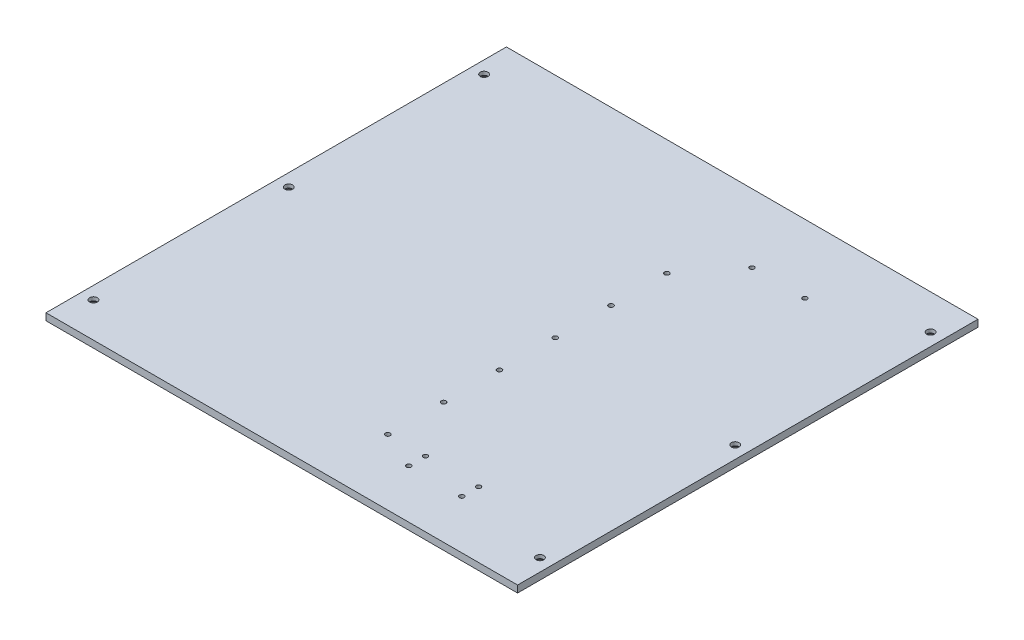
ISO-10303-21;
HEADER;
FILE_DESCRIPTION(('STEP AP214'),'2;1');
FILE_NAME('part.step','',(''),(''),'','','');
FILE_SCHEMA(('AUTOMOTIVE_DESIGN { 1 0 10303 214 1 1 1 1 }'));
ENDSEC;
DATA;
#1=APPLICATION_CONTEXT('core data for automotive mechanical design processes');
#2=APPLICATION_PROTOCOL_DEFINITION('international standard','automotive_design',2000,#1);
#3=PRODUCT_CONTEXT('',#1,'mechanical');
#4=PRODUCT('Part','Part','',(#3));
#5=PRODUCT_RELATED_PRODUCT_CATEGORY('part','',(#4));
#6=PRODUCT_DEFINITION_FORMATION('','',#4);
#7=PRODUCT_DEFINITION_CONTEXT('part definition',#1,'design');
#8=PRODUCT_DEFINITION('design','',#6,#7);
#9=PRODUCT_DEFINITION_SHAPE('','',#8);
#10=(LENGTH_UNIT() NAMED_UNIT(*) SI_UNIT(.MILLI.,.METRE.));
#11=(NAMED_UNIT(*) PLANE_ANGLE_UNIT() SI_UNIT($,.RADIAN.));
#12=(NAMED_UNIT(*) SI_UNIT($,.STERADIAN.) SOLID_ANGLE_UNIT());
#13=UNCERTAINTY_MEASURE_WITH_UNIT(LENGTH_MEASURE(1.E-05),#10,'distance_accuracy_value','');
#14=(GEOMETRIC_REPRESENTATION_CONTEXT(3) GLOBAL_UNCERTAINTY_ASSIGNED_CONTEXT((#13)) GLOBAL_UNIT_ASSIGNED_CONTEXT((#10,
#11,#12)) REPRESENTATION_CONTEXT('',''));
#15=CARTESIAN_POINT('',(0.,0.,0.));
#16=DIRECTION('',(0.,0.,1.));
#17=DIRECTION('',(1.,0.,0.));
#18=AXIS2_PLACEMENT_3D('',#15,#16,#17);
#19=CARTESIAN_POINT('',(0.,5.,0.));
#20=DIRECTION('',(0.,0.,-1.));
#21=DIRECTION('',(-1.,0.,0.));
#22=AXIS2_PLACEMENT_3D('',#19,#20,#21);
#23=PLANE('',#22);
#24=DIRECTION('',(1.,0.,0.));
#25=VECTOR('',#24,1.);
#26=CARTESIAN_POINT('',(0.,5.,0.));
#27=LINE('',#26,#25);
#28=CARTESIAN_POINT('',(1.00000000000004,5.,0.));
#29=VERTEX_POINT('',#28);
#30=CARTESIAN_POINT('',(339.,5.,0.));
#31=VERTEX_POINT('',#30);
#32=EDGE_CURVE('E96',#29,#31,#27,.T.);
#33=ORIENTED_EDGE('',*,*,#32,.F.);
#34=DIRECTION('',(0.,1.,0.));
#35=VECTOR('',#34,1.);
#36=CARTESIAN_POINT('',(1.00000000000004,-5.,0.));
#37=LINE('',#36,#35);
#38=CARTESIAN_POINT('',(1.00000000000004,0.,0.));
#39=VERTEX_POINT('',#38);
#40=EDGE_CURVE('E77',#39,#29,#37,.T.);
#41=ORIENTED_EDGE('',*,*,#40,.F.);
#42=DIRECTION('',(1.,0.,0.));
#43=VECTOR('',#42,1.);
#44=CARTESIAN_POINT('',(0.,0.,0.));
#45=LINE('',#44,#43);
#46=CARTESIAN_POINT('',(339.,0.,0.));
#47=VERTEX_POINT('',#46);
#48=EDGE_CURVE('E57',#39,#47,#45,.T.);
#49=ORIENTED_EDGE('',*,*,#48,.T.);
#50=DIRECTION('',(0.,1.,0.));
#51=VECTOR('',#50,1.);
#52=CARTESIAN_POINT('',(339.,-5.,0.));
#53=LINE('',#52,#51);
#54=EDGE_CURVE('E141',#47,#31,#53,.T.);
#55=ORIENTED_EDGE('',*,*,#54,.T.);
#56=EDGE_LOOP('',(#33,#41,#49,#55));
#57=FACE_BOUND('',#56,.T.);
#58=ADVANCED_FACE('F36',(#57),#23,.F.);
#59=CARTESIAN_POINT('',(0.,5.,-330.));
#60=DIRECTION('',(0.,0.,1.));
#61=DIRECTION('',(1.,0.,0.));
#62=AXIS2_PLACEMENT_3D('',#59,#60,#61);
#63=PLANE('',#62);
#64=DIRECTION('',(-1.,0.,0.));
#65=VECTOR('',#64,1.);
#66=CARTESIAN_POINT('',(0.,0.,-330.));
#67=LINE('',#66,#65);
#68=CARTESIAN_POINT('',(339.,0.,-330.));
#69=VERTEX_POINT('',#68);
#70=CARTESIAN_POINT('',(1.,0.,-330.));
#71=VERTEX_POINT('',#70);
#72=EDGE_CURVE('E90',#69,#71,#67,.T.);
#73=ORIENTED_EDGE('',*,*,#72,.T.);
#74=DIRECTION('',(0.,1.,0.));
#75=VECTOR('',#74,1.);
#76=CARTESIAN_POINT('',(1.,-5.,-330.));
#77=LINE('',#76,#75);
#78=CARTESIAN_POINT('',(1.,5.,-330.));
#79=VERTEX_POINT('',#78);
#80=EDGE_CURVE('E49',#71,#79,#77,.T.);
#81=ORIENTED_EDGE('',*,*,#80,.T.);
#82=DIRECTION('',(-1.,0.,0.));
#83=VECTOR('',#82,1.);
#84=CARTESIAN_POINT('',(0.,5.,-330.));
#85=LINE('',#84,#83);
#86=CARTESIAN_POINT('',(339.,5.,-330.));
#87=VERTEX_POINT('',#86);
#88=EDGE_CURVE('E88',#87,#79,#85,.T.);
#89=ORIENTED_EDGE('',*,*,#88,.F.);
#90=DIRECTION('',(0.,1.,0.));
#91=VECTOR('',#90,1.);
#92=CARTESIAN_POINT('',(339.,-5.,-330.));
#93=LINE('',#92,#91);
#94=EDGE_CURVE('E140',#69,#87,#93,.T.);
#95=ORIENTED_EDGE('',*,*,#94,.F.);
#96=EDGE_LOOP('',(#73,#81,#89,#95));
#97=FACE_BOUND('',#96,.T.);
#98=ADVANCED_FACE('F86',(#97),#63,.F.);
#99=CARTESIAN_POINT('',(0.,5.,0.));
#100=DIRECTION('',(0.,-1.,0.));
#101=DIRECTION('',(0.,0.,-1.));
#102=AXIS2_PLACEMENT_3D('',#99,#100,#101);
#103=PLANE('',#102);
#104=CARTESIAN_POINT('',(10.,5.,-25.));
#105=DIRECTION('',(0.,-1.,0.));
#106=DIRECTION('',(0.,0.,-1.));
#107=AXIS2_PLACEMENT_3D('',#104,#105,#106);
#108=CIRCLE('',#107,2.75);
#109=CARTESIAN_POINT('',(10.,5.,-27.75));
#110=VERTEX_POINT('',#109);
#111=EDGE_CURVE('E226',#110,#110,#108,.T.);
#112=ORIENTED_EDGE('',*,*,#111,.T.);
#113=EDGE_LOOP('',(#112));
#114=FACE_BOUND('',#113,.T.);
#115=CARTESIAN_POINT('',(10.,5.,-165.));
#116=DIRECTION('',(0.,-1.,0.));
#117=DIRECTION('',(0.,0.,-1.));
#118=AXIS2_PLACEMENT_3D('',#115,#116,#117);
#119=CIRCLE('',#118,2.75);
#120=CARTESIAN_POINT('',(10.,5.,-167.75));
#121=VERTEX_POINT('',#120);
#122=EDGE_CURVE('E217',#121,#121,#119,.T.);
#123=ORIENTED_EDGE('',*,*,#122,.T.);
#124=EDGE_LOOP('',(#123));
#125=FACE_BOUND('',#124,.T.);
#126=CARTESIAN_POINT('',(10.,5.,-305.));
#127=DIRECTION('',(0.,-1.,0.));
#128=DIRECTION('',(0.,0.,-1.));
#129=AXIS2_PLACEMENT_3D('',#126,#127,#128);
#130=CIRCLE('',#129,2.75);
#131=CARTESIAN_POINT('',(10.,5.,-307.75));
#132=VERTEX_POINT('',#131);
#133=EDGE_CURVE('E208',#132,#132,#130,.T.);
#134=ORIENTED_EDGE('',*,*,#133,.T.);
#135=EDGE_LOOP('',(#134));
#136=FACE_BOUND('',#135,.T.);
#137=CARTESIAN_POINT('',(330.,5.,-305.));
#138=DIRECTION('',(0.,-1.,0.));
#139=DIRECTION('',(0.,0.,-1.));
#140=AXIS2_PLACEMENT_3D('',#137,#138,#139);
#141=CIRCLE('',#140,2.74999999999997);
#142=CARTESIAN_POINT('',(330.,5.,-307.75));
#143=VERTEX_POINT('',#142);
#144=EDGE_CURVE('E199',#143,#143,#141,.T.);
#145=ORIENTED_EDGE('',*,*,#144,.T.);
#146=EDGE_LOOP('',(#145));
#147=FACE_BOUND('',#146,.T.);
#148=CARTESIAN_POINT('',(330.,5.,-165.));
#149=DIRECTION('',(0.,-1.,0.));
#150=DIRECTION('',(0.,0.,-1.));
#151=AXIS2_PLACEMENT_3D('',#148,#149,#150);
#152=CIRCLE('',#151,2.74999999999997);
#153=CARTESIAN_POINT('',(330.,5.,-167.75));
#154=VERTEX_POINT('',#153);
#155=EDGE_CURVE('E190',#154,#154,#152,.T.);
#156=ORIENTED_EDGE('',*,*,#155,.T.);
#157=EDGE_LOOP('',(#156));
#158=FACE_BOUND('',#157,.T.);
#159=CARTESIAN_POINT('',(330.,5.,-25.));
#160=DIRECTION('',(0.,-1.,0.));
#161=DIRECTION('',(0.,0.,-1.));
#162=AXIS2_PLACEMENT_3D('',#159,#160,#161);
#163=CIRCLE('',#162,2.74999999999997);
#164=CARTESIAN_POINT('',(330.,5.,-27.75));
#165=VERTEX_POINT('',#164);
#166=EDGE_CURVE('E181',#165,#165,#163,.T.);
#167=ORIENTED_EDGE('',*,*,#166,.T.);
#168=EDGE_LOOP('',(#167));
#169=FACE_BOUND('',#168,.T.);
#170=CARTESIAN_POINT('',(199.,5.,-47.));
#171=DIRECTION('',(0.,-1.,0.));
#172=DIRECTION('',(0.,0.,-1.));
#173=AXIS2_PLACEMENT_3D('',#170,#171,#172);
#174=CIRCLE('',#173,1.70000000000001);
#175=CARTESIAN_POINT('',(199.,5.,-48.7));
#176=VERTEX_POINT('',#175);
#177=EDGE_CURVE('E175',#176,#176,#174,.T.);
#178=ORIENTED_EDGE('',*,*,#177,.T.);
#179=EDGE_LOOP('',(#178));
#180=FACE_BOUND('',#179,.T.);
#181=CARTESIAN_POINT('',(199.,5.,-87.));
#182=DIRECTION('',(0.,-1.,0.));
#183=DIRECTION('',(0.,0.,-1.));
#184=AXIS2_PLACEMENT_3D('',#181,#182,#183);
#185=CIRCLE('',#184,1.70000000000001);
#186=CARTESIAN_POINT('',(199.,5.,-88.7));
#187=VERTEX_POINT('',#186);
#188=EDGE_CURVE('E169',#187,#187,#185,.T.);
#189=ORIENTED_EDGE('',*,*,#188,.T.);
#190=EDGE_LOOP('',(#189));
#191=FACE_BOUND('',#190,.T.);
#192=CARTESIAN_POINT('',(199.,5.,-127.));
#193=DIRECTION('',(0.,-1.,0.));
#194=DIRECTION('',(0.,0.,-1.));
#195=AXIS2_PLACEMENT_3D('',#192,#193,#194);
#196=CIRCLE('',#195,1.70000000000001);
#197=CARTESIAN_POINT('',(199.,5.,-128.7));
#198=VERTEX_POINT('',#197);
#199=EDGE_CURVE('E163',#198,#198,#196,.T.);
#200=ORIENTED_EDGE('',*,*,#199,.T.);
#201=EDGE_LOOP('',(#200));
#202=FACE_BOUND('',#201,.T.);
#203=CARTESIAN_POINT('',(199.,5.,-167.));
#204=DIRECTION('',(0.,-1.,0.));
#205=DIRECTION('',(0.,0.,-1.));
#206=AXIS2_PLACEMENT_3D('',#203,#204,#205);
#207=CIRCLE('',#206,1.70000000000001);
#208=CARTESIAN_POINT('',(199.,5.,-168.7));
#209=VERTEX_POINT('',#208);
#210=EDGE_CURVE('E157',#209,#209,#207,.T.);
#211=ORIENTED_EDGE('',*,*,#210,.T.);
#212=EDGE_LOOP('',(#211));
#213=FACE_BOUND('',#212,.T.);
#214=CARTESIAN_POINT('',(199.,5.,-207.));
#215=DIRECTION('',(0.,-1.,0.));
#216=DIRECTION('',(0.,0.,-1.));
#217=AXIS2_PLACEMENT_3D('',#214,#215,#216);
#218=CIRCLE('',#217,1.70000000000001);
#219=CARTESIAN_POINT('',(199.,5.,-208.7));
#220=VERTEX_POINT('',#219);
#221=EDGE_CURVE('E151',#220,#220,#218,.T.);
#222=ORIENTED_EDGE('',*,*,#221,.T.);
#223=EDGE_LOOP('',(#222));
#224=FACE_BOUND('',#223,.T.);
#225=CARTESIAN_POINT('',(199.,5.,-247.));
#226=DIRECTION('',(0.,-1.,0.));
#227=DIRECTION('',(0.,0.,-1.));
#228=AXIS2_PLACEMENT_3D('',#225,#226,#227);
#229=CIRCLE('',#228,1.70000000000001);
#230=CARTESIAN_POINT('',(199.,5.,-248.7));
#231=VERTEX_POINT('',#230);
#232=EDGE_CURVE('E81',#231,#231,#229,.T.);
#233=ORIENTED_EDGE('',*,*,#232,.T.);
#234=EDGE_LOOP('',(#233));
#235=FACE_BOUND('',#234,.T.);
#236=CARTESIAN_POINT('',(226.,5.,-281.));
#237=DIRECTION('',(0.,1.,0.));
#238=DIRECTION('',(0.,0.,1.));
#239=AXIS2_PLACEMENT_3D('',#236,#237,#238);
#240=CIRCLE('',#239,1.64999999999998);
#241=CARTESIAN_POINT('',(226.,5.,-279.35));
#242=VERTEX_POINT('',#241);
#243=EDGE_CURVE('E137',#242,#242,#240,.T.);
#244=ORIENTED_EDGE('',*,*,#243,.F.);
#245=EDGE_LOOP('',(#244));
#246=FACE_BOUND('',#245,.T.);
#247=CARTESIAN_POINT('',(264.,5.,-281.));
#248=DIRECTION('',(0.,1.,0.));
#249=DIRECTION('',(0.,0.,1.));
#250=AXIS2_PLACEMENT_3D('',#247,#248,#249);
#251=CIRCLE('',#250,1.64999999999998);
#252=CARTESIAN_POINT('',(264.,5.,-279.35));
#253=VERTEX_POINT('',#252);
#254=EDGE_CURVE('E131',#253,#253,#251,.T.);
#255=ORIENTED_EDGE('',*,*,#254,.F.);
#256=EDGE_LOOP('',(#255));
#257=FACE_BOUND('',#256,.T.);
#258=CARTESIAN_POINT('',(264.,5.,-35.));
#259=DIRECTION('',(0.,1.,0.));
#260=DIRECTION('',(0.,0.,1.));
#261=AXIS2_PLACEMENT_3D('',#258,#259,#260);
#262=CIRCLE('',#261,1.64999999999998);
#263=CARTESIAN_POINT('',(264.,5.,-33.35));
#264=VERTEX_POINT('',#263);
#265=EDGE_CURVE('E125',#264,#264,#262,.T.);
#266=ORIENTED_EDGE('',*,*,#265,.F.);
#267=EDGE_LOOP('',(#266));
#268=FACE_BOUND('',#267,.T.);
#269=CARTESIAN_POINT('',(226.,5.,-35.));
#270=DIRECTION('',(0.,1.,0.));
#271=DIRECTION('',(0.,0.,1.));
#272=AXIS2_PLACEMENT_3D('',#269,#270,#271);
#273=CIRCLE('',#272,1.64999999999998);
#274=CARTESIAN_POINT('',(226.,5.,-33.35));
#275=VERTEX_POINT('',#274);
#276=EDGE_CURVE('E119',#275,#275,#273,.T.);
#277=ORIENTED_EDGE('',*,*,#276,.F.);
#278=EDGE_LOOP('',(#277));
#279=FACE_BOUND('',#278,.T.);
#280=CARTESIAN_POINT('',(264.,5.,-47.));
#281=DIRECTION('',(0.,1.,0.));
#282=DIRECTION('',(0.,0.,1.));
#283=AXIS2_PLACEMENT_3D('',#280,#281,#282);
#284=CIRCLE('',#283,1.64999999999998);
#285=CARTESIAN_POINT('',(264.,5.,-45.35));
#286=VERTEX_POINT('',#285);
#287=EDGE_CURVE('E113',#286,#286,#284,.T.);
#288=ORIENTED_EDGE('',*,*,#287,.F.);
#289=EDGE_LOOP('',(#288));
#290=FACE_BOUND('',#289,.T.);
#291=CARTESIAN_POINT('',(226.,5.,-47.));
#292=DIRECTION('',(0.,1.,0.));
#293=DIRECTION('',(0.,0.,1.));
#294=AXIS2_PLACEMENT_3D('',#291,#292,#293);
#295=CIRCLE('',#294,1.64999999999998);
#296=CARTESIAN_POINT('',(226.,5.,-45.35));
#297=VERTEX_POINT('',#296);
#298=EDGE_CURVE('E104',#297,#297,#295,.T.);
#299=ORIENTED_EDGE('',*,*,#298,.F.);
#300=EDGE_LOOP('',(#299));
#301=FACE_BOUND('',#300,.T.);
#302=ORIENTED_EDGE('',*,*,#88,.T.);
#303=DIRECTION('',(0.,0.,-1.));
#304=VECTOR('',#303,1.);
#305=CARTESIAN_POINT('',(1.,5.,-330.));
#306=LINE('',#305,#304);
#307=EDGE_CURVE('E75',#29,#79,#306,.T.);
#308=ORIENTED_EDGE('',*,*,#307,.F.);
#309=ORIENTED_EDGE('',*,*,#32,.T.);
#310=DIRECTION('',(0.,0.,1.));
#311=VECTOR('',#310,1.);
#312=CARTESIAN_POINT('',(339.,5.,-330.));
#313=LINE('',#312,#311);
#314=EDGE_CURVE('E95',#87,#31,#313,.T.);
#315=ORIENTED_EDGE('',*,*,#314,.F.);
#316=EDGE_LOOP('',(#302,#308,#309,#315));
#317=FACE_BOUND('',#316,.T.);
#318=ADVANCED_FACE('F93',(#114,#125,#136,#147,#158,#169,#180,#191,#202,#213,#224,#235,#246,#257,
#268,#279,#290,#301,#317),#103,.F.);
#319=CARTESIAN_POINT('',(0.,0.,0.));
#320=DIRECTION('',(0.,-1.,0.));
#321=DIRECTION('',(0.,0.,-1.));
#322=AXIS2_PLACEMENT_3D('',#319,#320,#321);
#323=PLANE('',#322);
#324=CARTESIAN_POINT('',(10.,0.,-25.));
#325=DIRECTION('',(0.,-1.,0.));
#326=DIRECTION('',(0.,0.,-1.));
#327=AXIS2_PLACEMENT_3D('',#324,#325,#326);
#328=CIRCLE('',#327,5.2);
#329=CARTESIAN_POINT('',(10.,0.,-30.2));
#330=VERTEX_POINT('',#329);
#331=EDGE_CURVE('E232',#330,#330,#328,.T.);
#332=ORIENTED_EDGE('',*,*,#331,.F.);
#333=EDGE_LOOP('',(#332));
#334=FACE_BOUND('',#333,.T.);
#335=CARTESIAN_POINT('',(10.,0.,-165.));
#336=DIRECTION('',(0.,-1.,0.));
#337=DIRECTION('',(0.,0.,-1.));
#338=AXIS2_PLACEMENT_3D('',#335,#336,#337);
#339=CIRCLE('',#338,5.2);
#340=CARTESIAN_POINT('',(10.,0.,-170.2));
#341=VERTEX_POINT('',#340);
#342=EDGE_CURVE('E223',#341,#341,#339,.T.);
#343=ORIENTED_EDGE('',*,*,#342,.F.);
#344=EDGE_LOOP('',(#343));
#345=FACE_BOUND('',#344,.T.);
#346=CARTESIAN_POINT('',(10.,0.,-305.));
#347=DIRECTION('',(0.,-1.,0.));
#348=DIRECTION('',(0.,0.,-1.));
#349=AXIS2_PLACEMENT_3D('',#346,#347,#348);
#350=CIRCLE('',#349,5.2);
#351=CARTESIAN_POINT('',(10.,0.,-310.2));
#352=VERTEX_POINT('',#351);
#353=EDGE_CURVE('E214',#352,#352,#350,.T.);
#354=ORIENTED_EDGE('',*,*,#353,.F.);
#355=EDGE_LOOP('',(#354));
#356=FACE_BOUND('',#355,.T.);
#357=CARTESIAN_POINT('',(330.,0.,-305.));
#358=DIRECTION('',(0.,-1.,0.));
#359=DIRECTION('',(0.,0.,-1.));
#360=AXIS2_PLACEMENT_3D('',#357,#358,#359);
#361=CIRCLE('',#360,5.19999999999998);
#362=CARTESIAN_POINT('',(330.,0.,-310.2));
#363=VERTEX_POINT('',#362);
#364=EDGE_CURVE('E205',#363,#363,#361,.T.);
#365=ORIENTED_EDGE('',*,*,#364,.F.);
#366=EDGE_LOOP('',(#365));
#367=FACE_BOUND('',#366,.T.);
#368=CARTESIAN_POINT('',(330.,0.,-165.));
#369=DIRECTION('',(0.,-1.,0.));
#370=DIRECTION('',(0.,0.,-1.));
#371=AXIS2_PLACEMENT_3D('',#368,#369,#370);
#372=CIRCLE('',#371,5.19999999999998);
#373=CARTESIAN_POINT('',(330.,0.,-170.2));
#374=VERTEX_POINT('',#373);
#375=EDGE_CURVE('E196',#374,#374,#372,.T.);
#376=ORIENTED_EDGE('',*,*,#375,.F.);
#377=EDGE_LOOP('',(#376));
#378=FACE_BOUND('',#377,.T.);
#379=CARTESIAN_POINT('',(330.,0.,-25.));
#380=DIRECTION('',(0.,-1.,0.));
#381=DIRECTION('',(0.,0.,-1.));
#382=AXIS2_PLACEMENT_3D('',#379,#380,#381);
#383=CIRCLE('',#382,5.19999999999998);
#384=CARTESIAN_POINT('',(330.,0.,-30.2));
#385=VERTEX_POINT('',#384);
#386=EDGE_CURVE('E187',#385,#385,#383,.T.);
#387=ORIENTED_EDGE('',*,*,#386,.F.);
#388=EDGE_LOOP('',(#387));
#389=FACE_BOUND('',#388,.T.);
#390=CARTESIAN_POINT('',(199.,0.,-47.));
#391=DIRECTION('',(0.,-1.,0.));
#392=DIRECTION('',(0.,0.,-1.));
#393=AXIS2_PLACEMENT_3D('',#390,#391,#392);
#394=CIRCLE('',#393,1.70000000000001);
#395=CARTESIAN_POINT('',(199.,0.,-48.7));
#396=VERTEX_POINT('',#395);
#397=EDGE_CURVE('E178',#396,#396,#394,.T.);
#398=ORIENTED_EDGE('',*,*,#397,.F.);
#399=EDGE_LOOP('',(#398));
#400=FACE_BOUND('',#399,.T.);
#401=CARTESIAN_POINT('',(199.,0.,-87.));
#402=DIRECTION('',(0.,-1.,0.));
#403=DIRECTION('',(0.,0.,-1.));
#404=AXIS2_PLACEMENT_3D('',#401,#402,#403);
#405=CIRCLE('',#404,1.70000000000001);
#406=CARTESIAN_POINT('',(199.,0.,-88.7));
#407=VERTEX_POINT('',#406);
#408=EDGE_CURVE('E172',#407,#407,#405,.T.);
#409=ORIENTED_EDGE('',*,*,#408,.F.);
#410=EDGE_LOOP('',(#409));
#411=FACE_BOUND('',#410,.T.);
#412=CARTESIAN_POINT('',(199.,0.,-127.));
#413=DIRECTION('',(0.,-1.,0.));
#414=DIRECTION('',(0.,0.,-1.));
#415=AXIS2_PLACEMENT_3D('',#412,#413,#414);
#416=CIRCLE('',#415,1.70000000000001);
#417=CARTESIAN_POINT('',(199.,0.,-128.7));
#418=VERTEX_POINT('',#417);
#419=EDGE_CURVE('E166',#418,#418,#416,.T.);
#420=ORIENTED_EDGE('',*,*,#419,.F.);
#421=EDGE_LOOP('',(#420));
#422=FACE_BOUND('',#421,.T.);
#423=CARTESIAN_POINT('',(199.,0.,-167.));
#424=DIRECTION('',(0.,-1.,0.));
#425=DIRECTION('',(0.,0.,-1.));
#426=AXIS2_PLACEMENT_3D('',#423,#424,#425);
#427=CIRCLE('',#426,1.70000000000001);
#428=CARTESIAN_POINT('',(199.,0.,-168.7));
#429=VERTEX_POINT('',#428);
#430=EDGE_CURVE('E160',#429,#429,#427,.T.);
#431=ORIENTED_EDGE('',*,*,#430,.F.);
#432=EDGE_LOOP('',(#431));
#433=FACE_BOUND('',#432,.T.);
#434=CARTESIAN_POINT('',(199.,0.,-207.));
#435=DIRECTION('',(0.,-1.,0.));
#436=DIRECTION('',(0.,0.,-1.));
#437=AXIS2_PLACEMENT_3D('',#434,#435,#436);
#438=CIRCLE('',#437,1.70000000000001);
#439=CARTESIAN_POINT('',(199.,0.,-208.7));
#440=VERTEX_POINT('',#439);
#441=EDGE_CURVE('E154',#440,#440,#438,.T.);
#442=ORIENTED_EDGE('',*,*,#441,.F.);
#443=EDGE_LOOP('',(#442));
#444=FACE_BOUND('',#443,.T.);
#445=CARTESIAN_POINT('',(199.,0.,-247.));
#446=DIRECTION('',(0.,-1.,0.));
#447=DIRECTION('',(0.,0.,-1.));
#448=AXIS2_PLACEMENT_3D('',#445,#446,#447);
#449=CIRCLE('',#448,1.70000000000001);
#450=CARTESIAN_POINT('',(199.,0.,-248.7));
#451=VERTEX_POINT('',#450);
#452=EDGE_CURVE('E148',#451,#451,#449,.T.);
#453=ORIENTED_EDGE('',*,*,#452,.F.);
#454=EDGE_LOOP('',(#453));
#455=FACE_BOUND('',#454,.T.);
#456=DIRECTION('',(0.,0.,1.));
#457=VECTOR('',#456,1.);
#458=CARTESIAN_POINT('',(1.00000000000004,0.,0.));
#459=LINE('',#458,#457);
#460=EDGE_CURVE('E11',#71,#39,#459,.T.);
#461=ORIENTED_EDGE('',*,*,#460,.F.);
#462=ORIENTED_EDGE('',*,*,#72,.F.);
#463=DIRECTION('',(0.,0.,-1.));
#464=VECTOR('',#463,1.);
#465=CARTESIAN_POINT('',(339.,0.,0.));
#466=LINE('',#465,#464);
#467=EDGE_CURVE('E43',#47,#69,#466,.T.);
#468=ORIENTED_EDGE('',*,*,#467,.F.);
#469=ORIENTED_EDGE('',*,*,#48,.F.);
#470=EDGE_LOOP('',(#461,#462,#468,#469));
#471=FACE_BOUND('',#470,.T.);
#472=CARTESIAN_POINT('',(226.,0.,-281.));
#473=DIRECTION('',(0.,-1.,0.));
#474=DIRECTION('',(0.,0.,-1.));
#475=AXIS2_PLACEMENT_3D('',#472,#473,#474);
#476=CIRCLE('',#475,1.64999999999998);
#477=CARTESIAN_POINT('',(226.,0.,-282.65));
#478=VERTEX_POINT('',#477);
#479=EDGE_CURVE('E134',#478,#478,#476,.T.);
#480=ORIENTED_EDGE('',*,*,#479,.F.);
#481=EDGE_LOOP('',(#480));
#482=FACE_BOUND('',#481,.T.);
#483=CARTESIAN_POINT('',(264.,0.,-281.));
#484=DIRECTION('',(0.,-1.,0.));
#485=DIRECTION('',(0.,0.,-1.));
#486=AXIS2_PLACEMENT_3D('',#483,#484,#485);
#487=CIRCLE('',#486,1.64999999999998);
#488=CARTESIAN_POINT('',(264.,0.,-282.65));
#489=VERTEX_POINT('',#488);
#490=EDGE_CURVE('E128',#489,#489,#487,.T.);
#491=ORIENTED_EDGE('',*,*,#490,.F.);
#492=EDGE_LOOP('',(#491));
#493=FACE_BOUND('',#492,.T.);
#494=CARTESIAN_POINT('',(264.,0.,-35.));
#495=DIRECTION('',(0.,-1.,0.));
#496=DIRECTION('',(0.,0.,-1.));
#497=AXIS2_PLACEMENT_3D('',#494,#495,#496);
#498=CIRCLE('',#497,1.64999999999998);
#499=CARTESIAN_POINT('',(264.,0.,-36.65));
#500=VERTEX_POINT('',#499);
#501=EDGE_CURVE('E122',#500,#500,#498,.T.);
#502=ORIENTED_EDGE('',*,*,#501,.F.);
#503=EDGE_LOOP('',(#502));
#504=FACE_BOUND('',#503,.T.);
#505=CARTESIAN_POINT('',(226.,0.,-35.));
#506=DIRECTION('',(0.,-1.,0.));
#507=DIRECTION('',(0.,0.,-1.));
#508=AXIS2_PLACEMENT_3D('',#505,#506,#507);
#509=CIRCLE('',#508,1.64999999999998);
#510=CARTESIAN_POINT('',(226.,0.,-36.65));
#511=VERTEX_POINT('',#510);
#512=EDGE_CURVE('E116',#511,#511,#509,.T.);
#513=ORIENTED_EDGE('',*,*,#512,.F.);
#514=EDGE_LOOP('',(#513));
#515=FACE_BOUND('',#514,.T.);
#516=CARTESIAN_POINT('',(264.,0.,-47.));
#517=DIRECTION('',(0.,-1.,0.));
#518=DIRECTION('',(0.,0.,-1.));
#519=AXIS2_PLACEMENT_3D('',#516,#517,#518);
#520=CIRCLE('',#519,1.64999999999998);
#521=CARTESIAN_POINT('',(264.,0.,-48.65));
#522=VERTEX_POINT('',#521);
#523=EDGE_CURVE('E108',#522,#522,#520,.T.);
#524=ORIENTED_EDGE('',*,*,#523,.F.);
#525=EDGE_LOOP('',(#524));
#526=FACE_BOUND('',#525,.T.);
#527=CARTESIAN_POINT('',(226.,0.,-47.));
#528=DIRECTION('',(0.,-1.,0.));
#529=DIRECTION('',(0.,0.,-1.));
#530=AXIS2_PLACEMENT_3D('',#527,#528,#529);
#531=CIRCLE('',#530,1.64999999999998);
#532=CARTESIAN_POINT('',(226.,0.,-48.65));
#533=VERTEX_POINT('',#532);
#534=EDGE_CURVE('E102',#533,#533,#531,.T.);
#535=ORIENTED_EDGE('',*,*,#534,.F.);
#536=EDGE_LOOP('',(#535));
#537=FACE_BOUND('',#536,.T.);
#538=ADVANCED_FACE('F238',(#334,#345,#356,#367,#378,#389,#400,#411,#422,#433,#444,#455,#471,
#482,#493,#504,#515,#526,#537),#323,.T.);
#539=CARTESIAN_POINT('',(226.,5.,-47.));
#540=DIRECTION('',(0.,1.,0.));
#541=DIRECTION('',(0.,0.,1.));
#542=AXIS2_PLACEMENT_3D('',#539,#540,#541);
#543=CYLINDRICAL_SURFACE('',#542,1.64999999999998);
#544=ORIENTED_EDGE('',*,*,#534,.T.);
#545=EDGE_LOOP('',(#544));
#546=FACE_BOUND('',#545,.T.);
#547=ORIENTED_EDGE('',*,*,#298,.T.);
#548=EDGE_LOOP('',(#547));
#549=FACE_BOUND('',#548,.T.);
#550=ADVANCED_FACE('F241',(#546,#549),#543,.F.);
#551=CARTESIAN_POINT('',(264.,5.,-47.));
#552=DIRECTION('',(0.,1.,0.));
#553=DIRECTION('',(0.,0.,1.));
#554=AXIS2_PLACEMENT_3D('',#551,#552,#553);
#555=CYLINDRICAL_SURFACE('',#554,1.64999999999998);
#556=ORIENTED_EDGE('',*,*,#523,.T.);
#557=EDGE_LOOP('',(#556));
#558=FACE_BOUND('',#557,.T.);
#559=ORIENTED_EDGE('',*,*,#287,.T.);
#560=EDGE_LOOP('',(#559));
#561=FACE_BOUND('',#560,.T.);
#562=ADVANCED_FACE('F277',(#558,#561),#555,.F.);
#563=CARTESIAN_POINT('',(226.,5.,-35.));
#564=DIRECTION('',(0.,1.,0.));
#565=DIRECTION('',(0.,0.,1.));
#566=AXIS2_PLACEMENT_3D('',#563,#564,#565);
#567=CYLINDRICAL_SURFACE('',#566,1.64999999999998);
#568=ORIENTED_EDGE('',*,*,#512,.T.);
#569=EDGE_LOOP('',(#568));
#570=FACE_BOUND('',#569,.T.);
#571=ORIENTED_EDGE('',*,*,#276,.T.);
#572=EDGE_LOOP('',(#571));
#573=FACE_BOUND('',#572,.T.);
#574=ADVANCED_FACE('F280',(#570,#573),#567,.F.);
#575=CARTESIAN_POINT('',(264.,5.,-35.));
#576=DIRECTION('',(0.,1.,0.));
#577=DIRECTION('',(0.,0.,1.));
#578=AXIS2_PLACEMENT_3D('',#575,#576,#577);
#579=CYLINDRICAL_SURFACE('',#578,1.64999999999998);
#580=ORIENTED_EDGE('',*,*,#501,.T.);
#581=EDGE_LOOP('',(#580));
#582=FACE_BOUND('',#581,.T.);
#583=ORIENTED_EDGE('',*,*,#265,.T.);
#584=EDGE_LOOP('',(#583));
#585=FACE_BOUND('',#584,.T.);
#586=ADVANCED_FACE('F318',(#582,#585),#579,.F.);
#587=CARTESIAN_POINT('',(264.,5.,-281.));
#588=DIRECTION('',(0.,1.,0.));
#589=DIRECTION('',(0.,0.,1.));
#590=AXIS2_PLACEMENT_3D('',#587,#588,#589);
#591=CYLINDRICAL_SURFACE('',#590,1.64999999999998);
#592=ORIENTED_EDGE('',*,*,#490,.T.);
#593=EDGE_LOOP('',(#592));
#594=FACE_BOUND('',#593,.T.);
#595=ORIENTED_EDGE('',*,*,#254,.T.);
#596=EDGE_LOOP('',(#595));
#597=FACE_BOUND('',#596,.T.);
#598=ADVANCED_FACE('F311',(#594,#597),#591,.F.);
#599=CARTESIAN_POINT('',(226.,5.,-281.));
#600=DIRECTION('',(0.,1.,0.));
#601=DIRECTION('',(0.,0.,1.));
#602=AXIS2_PLACEMENT_3D('',#599,#600,#601);
#603=CYLINDRICAL_SURFACE('',#602,1.64999999999998);
#604=ORIENTED_EDGE('',*,*,#479,.T.);
#605=EDGE_LOOP('',(#604));
#606=FACE_BOUND('',#605,.T.);
#607=ORIENTED_EDGE('',*,*,#243,.T.);
#608=EDGE_LOOP('',(#607));
#609=FACE_BOUND('',#608,.T.);
#610=ADVANCED_FACE('F303',(#606,#609),#603,.F.);
#611=CARTESIAN_POINT('',(339.,-5.,-330.));
#612=DIRECTION('',(-1.,0.,0.));
#613=DIRECTION('',(0.,0.,1.));
#614=AXIS2_PLACEMENT_3D('',#611,#612,#613);
#615=PLANE('',#614);
#616=ORIENTED_EDGE('',*,*,#467,.T.);
#617=ORIENTED_EDGE('',*,*,#94,.T.);
#618=ORIENTED_EDGE('',*,*,#314,.T.);
#619=ORIENTED_EDGE('',*,*,#54,.F.);
#620=EDGE_LOOP('',(#616,#617,#618,#619));
#621=FACE_BOUND('',#620,.T.);
#622=ADVANCED_FACE('F300',(#621),#615,.F.);
#623=CARTESIAN_POINT('',(1.,-5.,-330.));
#624=DIRECTION('',(1.,0.,0.));
#625=DIRECTION('',(0.,0.,-1.));
#626=AXIS2_PLACEMENT_3D('',#623,#624,#625);
#627=PLANE('',#626);
#628=ORIENTED_EDGE('',*,*,#460,.T.);
#629=ORIENTED_EDGE('',*,*,#40,.T.);
#630=ORIENTED_EDGE('',*,*,#307,.T.);
#631=ORIENTED_EDGE('',*,*,#80,.F.);
#632=EDGE_LOOP('',(#628,#629,#630,#631));
#633=FACE_BOUND('',#632,.T.);
#634=ADVANCED_FACE('F76',(#633),#627,.F.);
#635=CARTESIAN_POINT('',(199.,0.,-247.));
#636=DIRECTION('',(0.,-1.,0.));
#637=DIRECTION('',(0.,0.,-1.));
#638=AXIS2_PLACEMENT_3D('',#635,#636,#637);
#639=CYLINDRICAL_SURFACE('',#638,1.70000000000001);
#640=ORIENTED_EDGE('',*,*,#452,.T.);
#641=EDGE_LOOP('',(#640));
#642=FACE_BOUND('',#641,.T.);
#643=ORIENTED_EDGE('',*,*,#232,.F.);
#644=EDGE_LOOP('',(#643));
#645=FACE_BOUND('',#644,.T.);
#646=ADVANCED_FACE('F309',(#642,#645),#639,.F.);
#647=CARTESIAN_POINT('',(199.,0.,-207.));
#648=DIRECTION('',(0.,-1.,0.));
#649=DIRECTION('',(0.,0.,-1.));
#650=AXIS2_PLACEMENT_3D('',#647,#648,#649);
#651=CYLINDRICAL_SURFACE('',#650,1.70000000000001);
#652=ORIENTED_EDGE('',*,*,#441,.T.);
#653=EDGE_LOOP('',(#652));
#654=FACE_BOUND('',#653,.T.);
#655=ORIENTED_EDGE('',*,*,#221,.F.);
#656=EDGE_LOOP('',(#655));
#657=FACE_BOUND('',#656,.T.);
#658=ADVANCED_FACE('F379',(#654,#657),#651,.F.);
#659=CARTESIAN_POINT('',(199.,0.,-167.));
#660=DIRECTION('',(0.,-1.,0.));
#661=DIRECTION('',(0.,0.,-1.));
#662=AXIS2_PLACEMENT_3D('',#659,#660,#661);
#663=CYLINDRICAL_SURFACE('',#662,1.70000000000001);
#664=ORIENTED_EDGE('',*,*,#430,.T.);
#665=EDGE_LOOP('',(#664));
#666=FACE_BOUND('',#665,.T.);
#667=ORIENTED_EDGE('',*,*,#210,.F.);
#668=EDGE_LOOP('',(#667));
#669=FACE_BOUND('',#668,.T.);
#670=ADVANCED_FACE('F388',(#666,#669),#663,.F.);
#671=CARTESIAN_POINT('',(199.,0.,-127.));
#672=DIRECTION('',(0.,-1.,0.));
#673=DIRECTION('',(0.,0.,-1.));
#674=AXIS2_PLACEMENT_3D('',#671,#672,#673);
#675=CYLINDRICAL_SURFACE('',#674,1.70000000000001);
#676=ORIENTED_EDGE('',*,*,#419,.T.);
#677=EDGE_LOOP('',(#676));
#678=FACE_BOUND('',#677,.T.);
#679=ORIENTED_EDGE('',*,*,#199,.F.);
#680=EDGE_LOOP('',(#679));
#681=FACE_BOUND('',#680,.T.);
#682=ADVANCED_FACE('F398',(#678,#681),#675,.F.);
#683=CARTESIAN_POINT('',(199.,0.,-87.));
#684=DIRECTION('',(0.,-1.,0.));
#685=DIRECTION('',(0.,0.,-1.));
#686=AXIS2_PLACEMENT_3D('',#683,#684,#685);
#687=CYLINDRICAL_SURFACE('',#686,1.70000000000001);
#688=ORIENTED_EDGE('',*,*,#408,.T.);
#689=EDGE_LOOP('',(#688));
#690=FACE_BOUND('',#689,.T.);
#691=ORIENTED_EDGE('',*,*,#188,.F.);
#692=EDGE_LOOP('',(#691));
#693=FACE_BOUND('',#692,.T.);
#694=ADVANCED_FACE('F408',(#690,#693),#687,.F.);
#695=CARTESIAN_POINT('',(199.,0.,-47.));
#696=DIRECTION('',(0.,-1.,0.));
#697=DIRECTION('',(0.,0.,-1.));
#698=AXIS2_PLACEMENT_3D('',#695,#696,#697);
#699=CYLINDRICAL_SURFACE('',#698,1.70000000000001);
#700=ORIENTED_EDGE('',*,*,#397,.T.);
#701=EDGE_LOOP('',(#700));
#702=FACE_BOUND('',#701,.T.);
#703=ORIENTED_EDGE('',*,*,#177,.F.);
#704=EDGE_LOOP('',(#703));
#705=FACE_BOUND('',#704,.T.);
#706=ADVANCED_FACE('F418',(#702,#705),#699,.F.);
#707=CARTESIAN_POINT('',(330.,0.,-25.));
#708=DIRECTION('',(0.,-1.,0.));
#709=DIRECTION('',(0.,0.,-1.));
#710=AXIS2_PLACEMENT_3D('',#707,#708,#709);
#711=CYLINDRICAL_SURFACE('',#710,2.74999999999997);
#712=ORIENTED_EDGE('',*,*,#166,.F.);
#713=EDGE_LOOP('',(#712));
#714=FACE_BOUND('',#713,.T.);
#715=CARTESIAN_POINT('',(330.,2.45,-25.));
#716=DIRECTION('',(0.,-1.,0.));
#717=DIRECTION('',(0.,0.,-1.));
#718=AXIS2_PLACEMENT_3D('',#715,#716,#717);
#719=CIRCLE('',#718,2.74999999999997);
#720=CARTESIAN_POINT('',(330.,2.45,-27.75));
#721=VERTEX_POINT('',#720);
#722=EDGE_CURVE('E184',#721,#721,#719,.T.);
#723=ORIENTED_EDGE('',*,*,#722,.T.);
#724=EDGE_LOOP('',(#723));
#725=FACE_BOUND('',#724,.T.);
#726=ADVANCED_FACE('F427',(#714,#725),#711,.F.);
#727=CARTESIAN_POINT('',(330.,0.,-25.));
#728=DIRECTION('',(0.,-1.,0.));
#729=DIRECTION('',(0.,0.,-1.));
#730=AXIS2_PLACEMENT_3D('',#727,#728,#729);
#731=CONICAL_SURFACE('',#730,5.19999999999998,0.78539816339745);
#732=ORIENTED_EDGE('',*,*,#722,.F.);
#733=EDGE_LOOP('',(#732));
#734=FACE_BOUND('',#733,.T.);
#735=ORIENTED_EDGE('',*,*,#386,.T.);
#736=EDGE_LOOP('',(#735));
#737=FACE_BOUND('',#736,.T.);
#738=ADVANCED_FACE('F443',(#734,#737),#731,.F.);
#739=CARTESIAN_POINT('',(330.,0.,-165.));
#740=DIRECTION('',(0.,-1.,0.));
#741=DIRECTION('',(0.,0.,-1.));
#742=AXIS2_PLACEMENT_3D('',#739,#740,#741);
#743=CYLINDRICAL_SURFACE('',#742,2.74999999999997);
#744=ORIENTED_EDGE('',*,*,#155,.F.);
#745=EDGE_LOOP('',(#744));
#746=FACE_BOUND('',#745,.T.);
#747=CARTESIAN_POINT('',(330.,2.45,-165.));
#748=DIRECTION('',(0.,-1.,0.));
#749=DIRECTION('',(0.,0.,-1.));
#750=AXIS2_PLACEMENT_3D('',#747,#748,#749);
#751=CIRCLE('',#750,2.74999999999997);
#752=CARTESIAN_POINT('',(330.,2.45,-167.75));
#753=VERTEX_POINT('',#752);
#754=EDGE_CURVE('E193',#753,#753,#751,.T.);
#755=ORIENTED_EDGE('',*,*,#754,.T.);
#756=EDGE_LOOP('',(#755));
#757=FACE_BOUND('',#756,.T.);
#758=ADVANCED_FACE('F453',(#746,#757),#743,.F.);
#759=CARTESIAN_POINT('',(330.,0.,-165.));
#760=DIRECTION('',(0.,-1.,0.));
#761=DIRECTION('',(0.,0.,-1.));
#762=AXIS2_PLACEMENT_3D('',#759,#760,#761);
#763=CONICAL_SURFACE('',#762,5.19999999999998,0.78539816339745);
#764=ORIENTED_EDGE('',*,*,#754,.F.);
#765=EDGE_LOOP('',(#764));
#766=FACE_BOUND('',#765,.T.);
#767=ORIENTED_EDGE('',*,*,#375,.T.);
#768=EDGE_LOOP('',(#767));
#769=FACE_BOUND('',#768,.T.);
#770=ADVANCED_FACE('F463',(#766,#769),#763,.F.);
#771=CARTESIAN_POINT('',(330.,0.,-305.));
#772=DIRECTION('',(0.,-1.,0.));
#773=DIRECTION('',(0.,0.,-1.));
#774=AXIS2_PLACEMENT_3D('',#771,#772,#773);
#775=CYLINDRICAL_SURFACE('',#774,2.74999999999997);
#776=ORIENTED_EDGE('',*,*,#144,.F.);
#777=EDGE_LOOP('',(#776));
#778=FACE_BOUND('',#777,.T.);
#779=CARTESIAN_POINT('',(330.,2.45,-305.));
#780=DIRECTION('',(0.,-1.,0.));
#781=DIRECTION('',(0.,0.,-1.));
#782=AXIS2_PLACEMENT_3D('',#779,#780,#781);
#783=CIRCLE('',#782,2.74999999999997);
#784=CARTESIAN_POINT('',(330.,2.45,-307.75));
#785=VERTEX_POINT('',#784);
#786=EDGE_CURVE('E202',#785,#785,#783,.T.);
#787=ORIENTED_EDGE('',*,*,#786,.T.);
#788=EDGE_LOOP('',(#787));
#789=FACE_BOUND('',#788,.T.);
#790=ADVANCED_FACE('F473',(#778,#789),#775,.F.);
#791=CARTESIAN_POINT('',(330.,0.,-305.));
#792=DIRECTION('',(0.,-1.,0.));
#793=DIRECTION('',(0.,0.,-1.));
#794=AXIS2_PLACEMENT_3D('',#791,#792,#793);
#795=CONICAL_SURFACE('',#794,5.19999999999998,0.78539816339745);
#796=ORIENTED_EDGE('',*,*,#786,.F.);
#797=EDGE_LOOP('',(#796));
#798=FACE_BOUND('',#797,.T.);
#799=ORIENTED_EDGE('',*,*,#364,.T.);
#800=EDGE_LOOP('',(#799));
#801=FACE_BOUND('',#800,.T.);
#802=ADVANCED_FACE('F483',(#798,#801),#795,.F.);
#803=CARTESIAN_POINT('',(10.,0.,-305.));
#804=DIRECTION('',(0.,-1.,0.));
#805=DIRECTION('',(0.,0.,-1.));
#806=AXIS2_PLACEMENT_3D('',#803,#804,#805);
#807=CYLINDRICAL_SURFACE('',#806,2.75);
#808=ORIENTED_EDGE('',*,*,#133,.F.);
#809=EDGE_LOOP('',(#808));
#810=FACE_BOUND('',#809,.T.);
#811=CARTESIAN_POINT('',(10.,2.45,-305.));
#812=DIRECTION('',(0.,-1.,0.));
#813=DIRECTION('',(0.,0.,-1.));
#814=AXIS2_PLACEMENT_3D('',#811,#812,#813);
#815=CIRCLE('',#814,2.75);
#816=CARTESIAN_POINT('',(10.,2.45,-307.75));
#817=VERTEX_POINT('',#816);
#818=EDGE_CURVE('E211',#817,#817,#815,.T.);
#819=ORIENTED_EDGE('',*,*,#818,.T.);
#820=EDGE_LOOP('',(#819));
#821=FACE_BOUND('',#820,.T.);
#822=ADVANCED_FACE('F493',(#810,#821),#807,.F.);
#823=CARTESIAN_POINT('',(10.,0.,-305.));
#824=DIRECTION('',(0.,-1.,0.));
#825=DIRECTION('',(0.,0.,-1.));
#826=AXIS2_PLACEMENT_3D('',#823,#824,#825);
#827=CONICAL_SURFACE('',#826,5.2,0.785398163397449);
#828=ORIENTED_EDGE('',*,*,#818,.F.);
#829=EDGE_LOOP('',(#828));
#830=FACE_BOUND('',#829,.T.);
#831=ORIENTED_EDGE('',*,*,#353,.T.);
#832=EDGE_LOOP('',(#831));
#833=FACE_BOUND('',#832,.T.);
#834=ADVANCED_FACE('F503',(#830,#833),#827,.F.);
#835=CARTESIAN_POINT('',(10.,0.,-165.));
#836=DIRECTION('',(0.,-1.,0.));
#837=DIRECTION('',(0.,0.,-1.));
#838=AXIS2_PLACEMENT_3D('',#835,#836,#837);
#839=CYLINDRICAL_SURFACE('',#838,2.75);
#840=ORIENTED_EDGE('',*,*,#122,.F.);
#841=EDGE_LOOP('',(#840));
#842=FACE_BOUND('',#841,.T.);
#843=CARTESIAN_POINT('',(10.,2.45,-165.));
#844=DIRECTION('',(0.,-1.,0.));
#845=DIRECTION('',(0.,0.,-1.));
#846=AXIS2_PLACEMENT_3D('',#843,#844,#845);
#847=CIRCLE('',#846,2.75);
#848=CARTESIAN_POINT('',(10.,2.45,-167.75));
#849=VERTEX_POINT('',#848);
#850=EDGE_CURVE('E220',#849,#849,#847,.T.);
#851=ORIENTED_EDGE('',*,*,#850,.T.);
#852=EDGE_LOOP('',(#851));
#853=FACE_BOUND('',#852,.T.);
#854=ADVANCED_FACE('F513',(#842,#853),#839,.F.);
#855=CARTESIAN_POINT('',(10.,0.,-165.));
#856=DIRECTION('',(0.,-1.,0.));
#857=DIRECTION('',(0.,0.,-1.));
#858=AXIS2_PLACEMENT_3D('',#855,#856,#857);
#859=CONICAL_SURFACE('',#858,5.2,0.785398163397449);
#860=ORIENTED_EDGE('',*,*,#850,.F.);
#861=EDGE_LOOP('',(#860));
#862=FACE_BOUND('',#861,.T.);
#863=ORIENTED_EDGE('',*,*,#342,.T.);
#864=EDGE_LOOP('',(#863));
#865=FACE_BOUND('',#864,.T.);
#866=ADVANCED_FACE('F523',(#862,#865),#859,.F.);
#867=CARTESIAN_POINT('',(10.,0.,-25.));
#868=DIRECTION('',(0.,-1.,0.));
#869=DIRECTION('',(0.,0.,-1.));
#870=AXIS2_PLACEMENT_3D('',#867,#868,#869);
#871=CYLINDRICAL_SURFACE('',#870,2.75);
#872=ORIENTED_EDGE('',*,*,#111,.F.);
#873=EDGE_LOOP('',(#872));
#874=FACE_BOUND('',#873,.T.);
#875=CARTESIAN_POINT('',(10.,2.45,-25.));
#876=DIRECTION('',(0.,-1.,0.));
#877=DIRECTION('',(0.,0.,-1.));
#878=AXIS2_PLACEMENT_3D('',#875,#876,#877);
#879=CIRCLE('',#878,2.75);
#880=CARTESIAN_POINT('',(10.,2.45,-27.75));
#881=VERTEX_POINT('',#880);
#882=EDGE_CURVE('E229',#881,#881,#879,.T.);
#883=ORIENTED_EDGE('',*,*,#882,.T.);
#884=EDGE_LOOP('',(#883));
#885=FACE_BOUND('',#884,.T.);
#886=ADVANCED_FACE('F533',(#874,#885),#871,.F.);
#887=CARTESIAN_POINT('',(10.,0.,-25.));
#888=DIRECTION('',(0.,-1.,0.));
#889=DIRECTION('',(0.,0.,-1.));
#890=AXIS2_PLACEMENT_3D('',#887,#888,#889);
#891=CONICAL_SURFACE('',#890,5.2,0.785398163397449);
#892=ORIENTED_EDGE('',*,*,#882,.F.);
#893=EDGE_LOOP('',(#892));
#894=FACE_BOUND('',#893,.T.);
#895=ORIENTED_EDGE('',*,*,#331,.T.);
#896=EDGE_LOOP('',(#895));
#897=FACE_BOUND('',#896,.T.);
#898=ADVANCED_FACE('F236',(#894,#897),#891,.F.);
#899=CLOSED_SHELL('',(#58,#98,#318,#538,#550,#562,#574,#586,#598,#610,#622,#634,#646,#658,#670,
#682,#694,#706,#726,#738,#758,#770,#790,#802,#822,#834,#854,#866,#886,#898));
#900=MANIFOLD_SOLID_BREP('B2',#899);
#901=ADVANCED_BREP_SHAPE_REPRESENTATION('',(#18,#900),#14);
#902=SHAPE_DEFINITION_REPRESENTATION(#9,#901);
ENDSEC;
END-ISO-10303-21;
